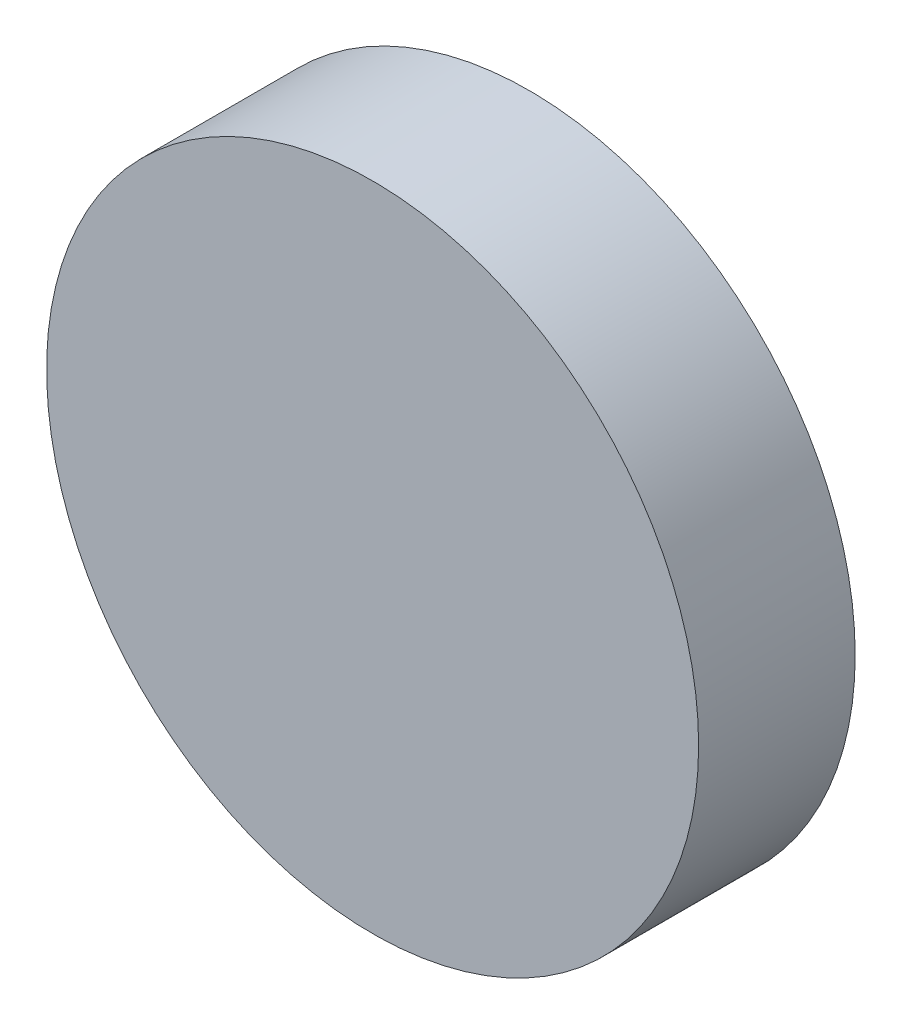
ISO-10303-21;
HEADER;
FILE_DESCRIPTION(('STEP AP214'),'2;1');
FILE_NAME('part.step','',(''),(''),'','','');
FILE_SCHEMA(('AUTOMOTIVE_DESIGN { 1 0 10303 214 1 1 1 1 }'));
ENDSEC;
DATA;
#1=APPLICATION_CONTEXT('core data for automotive mechanical design processes');
#2=APPLICATION_PROTOCOL_DEFINITION('international standard','automotive_design',2000,#1);
#3=PRODUCT_CONTEXT('',#1,'mechanical');
#4=PRODUCT('Part','Part','',(#3));
#5=PRODUCT_RELATED_PRODUCT_CATEGORY('part','',(#4));
#6=PRODUCT_DEFINITION_FORMATION('','',#4);
#7=PRODUCT_DEFINITION_CONTEXT('part definition',#1,'design');
#8=PRODUCT_DEFINITION('design','',#6,#7);
#9=PRODUCT_DEFINITION_SHAPE('','',#8);
#10=(LENGTH_UNIT() NAMED_UNIT(*) SI_UNIT(.MILLI.,.METRE.));
#11=(NAMED_UNIT(*) PLANE_ANGLE_UNIT() SI_UNIT($,.RADIAN.));
#12=(NAMED_UNIT(*) SI_UNIT($,.STERADIAN.) SOLID_ANGLE_UNIT());
#13=UNCERTAINTY_MEASURE_WITH_UNIT(LENGTH_MEASURE(1.E-05),#10,'distance_accuracy_value','');
#14=(GEOMETRIC_REPRESENTATION_CONTEXT(3) GLOBAL_UNCERTAINTY_ASSIGNED_CONTEXT((#13)) GLOBAL_UNIT_ASSIGNED_CONTEXT((#10,
#11,#12)) REPRESENTATION_CONTEXT('',''));
#15=CARTESIAN_POINT('',(0.,0.,0.));
#16=DIRECTION('',(0.,0.,1.));
#17=DIRECTION('',(1.,0.,0.));
#18=AXIS2_PLACEMENT_3D('',#15,#16,#17);
#19=CARTESIAN_POINT('',(0.,0.,8.2));
#20=DIRECTION('',(0.,0.,-1.));
#21=DIRECTION('',(-1.,0.,0.));
#22=AXIS2_PLACEMENT_3D('',#19,#20,#21);
#23=CYLINDRICAL_SURFACE('',#22,17.075);
#24=CARTESIAN_POINT('',(0.,0.,8.2));
#25=DIRECTION('',(0.,0.,1.));
#26=DIRECTION('',(1.,0.,0.));
#27=AXIS2_PLACEMENT_3D('',#24,#25,#26);
#28=CIRCLE('',#27,17.075);
#29=CARTESIAN_POINT('',(17.075,0.,8.2));
#30=VERTEX_POINT('',#29);
#31=EDGE_CURVE('E10',#30,#30,#28,.T.);
#32=ORIENTED_EDGE('',*,*,#31,.F.);
#33=EDGE_LOOP('',(#32));
#34=FACE_BOUND('',#33,.T.);
#35=CARTESIAN_POINT('',(0.,0.,0.));
#36=DIRECTION('',(0.,0.,1.));
#37=DIRECTION('',(1.,0.,0.));
#38=AXIS2_PLACEMENT_3D('',#35,#36,#37);
#39=CIRCLE('',#38,17.075);
#40=CARTESIAN_POINT('',(17.075,0.,0.));
#41=VERTEX_POINT('',#40);
#42=EDGE_CURVE('E40',#41,#41,#39,.T.);
#43=ORIENTED_EDGE('',*,*,#42,.T.);
#44=EDGE_LOOP('',(#43));
#45=FACE_BOUND('',#44,.T.);
#46=ADVANCED_FACE('F37',(#34,#45),#23,.T.);
#47=CARTESIAN_POINT('',(0.,0.,8.2));
#48=DIRECTION('',(0.,0.,1.));
#49=DIRECTION('',(1.,0.,0.));
#50=AXIS2_PLACEMENT_3D('',#47,#48,#49);
#51=PLANE('',#50);
#52=ORIENTED_EDGE('',*,*,#31,.T.);
#53=EDGE_LOOP('',(#52));
#54=FACE_BOUND('',#53,.T.);
#55=ADVANCED_FACE('F70',(#54),#51,.T.);
#56=CARTESIAN_POINT('',(0.,0.,0.));
#57=DIRECTION('',(0.,0.,1.));
#58=DIRECTION('',(1.,0.,0.));
#59=AXIS2_PLACEMENT_3D('',#56,#57,#58);
#60=PLANE('',#59);
#61=CARTESIAN_POINT('',(0.,0.,0.));
#62=DIRECTION('',(0.,0.,-1.));
#63=DIRECTION('',(-1.,0.,0.));
#64=AXIS2_PLACEMENT_3D('',#61,#62,#63);
#65=CIRCLE('',#64,8.85);
#66=CARTESIAN_POINT('',(-8.85,0.,0.));
#67=VERTEX_POINT('',#66);
#68=EDGE_CURVE('E51',#67,#67,#65,.T.);
#69=ORIENTED_EDGE('',*,*,#68,.F.);
#70=EDGE_LOOP('',(#69));
#71=FACE_BOUND('',#70,.T.);
#72=ORIENTED_EDGE('',*,*,#42,.F.);
#73=EDGE_LOOP('',(#72));
#74=FACE_BOUND('',#73,.T.);
#75=ADVANCED_FACE('F64',(#71,#74),#60,.F.);
#76=CARTESIAN_POINT('',(0.,0.,5.));
#77=DIRECTION('',(0.,0.,-1.));
#78=DIRECTION('',(-1.,0.,0.));
#79=AXIS2_PLACEMENT_3D('',#76,#77,#78);
#80=CYLINDRICAL_SURFACE('',#79,8.85);
#81=CARTESIAN_POINT('',(0.,0.,5.));
#82=DIRECTION('',(0.,0.,-1.));
#83=DIRECTION('',(-1.,0.,0.));
#84=AXIS2_PLACEMENT_3D('',#81,#82,#83);
#85=CIRCLE('',#84,8.85);
#86=CARTESIAN_POINT('',(-8.85,0.,5.));
#87=VERTEX_POINT('',#86);
#88=EDGE_CURVE('E49',#87,#87,#85,.T.);
#89=ORIENTED_EDGE('',*,*,#88,.F.);
#90=EDGE_LOOP('',(#89));
#91=FACE_BOUND('',#90,.T.);
#92=ORIENTED_EDGE('',*,*,#68,.T.);
#93=EDGE_LOOP('',(#92));
#94=FACE_BOUND('',#93,.T.);
#95=ADVANCED_FACE('F61',(#91,#94),#80,.F.);
#96=CARTESIAN_POINT('',(0.,0.,5.));
#97=DIRECTION('',(0.,0.,-1.));
#98=DIRECTION('',(-1.,0.,0.));
#99=AXIS2_PLACEMENT_3D('',#96,#97,#98);
#100=PLANE('',#99);
#101=ORIENTED_EDGE('',*,*,#88,.T.);
#102=EDGE_LOOP('',(#101));
#103=FACE_BOUND('',#102,.T.);
#104=ADVANCED_FACE('F59',(#103),#100,.T.);
#105=CLOSED_SHELL('',(#46,#55,#75,#95,#104));
#106=MANIFOLD_SOLID_BREP('B2',#105);
#107=ADVANCED_BREP_SHAPE_REPRESENTATION('',(#18,#106),#14);
#108=SHAPE_DEFINITION_REPRESENTATION(#9,#107);
ENDSEC;
END-ISO-10303-21;
